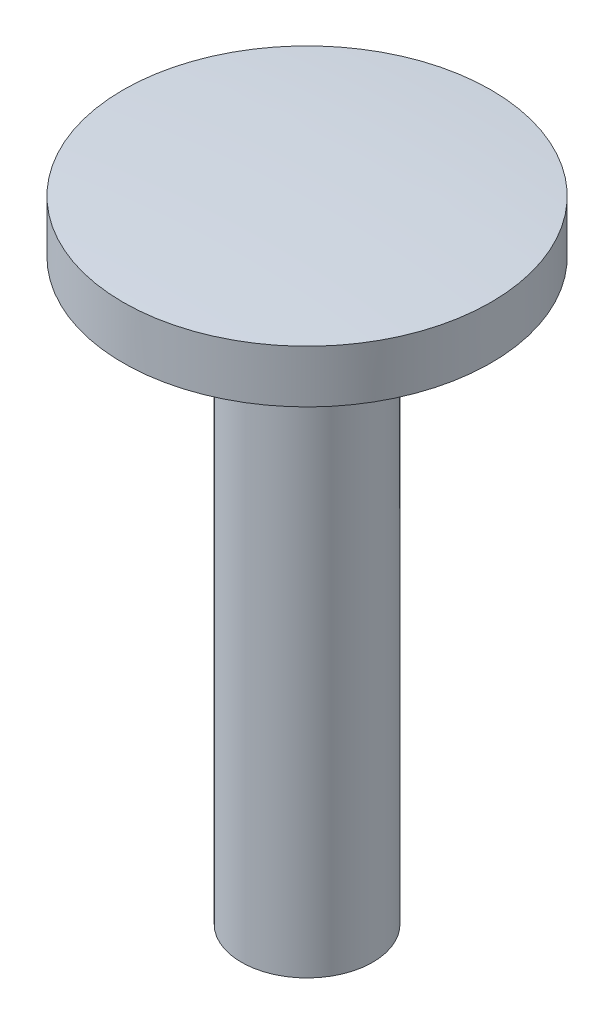
ISO-10303-21;
HEADER;
FILE_DESCRIPTION(('STEP AP214'),'2;1');
FILE_NAME('part.step','',(''),(''),'','','');
FILE_SCHEMA(('AUTOMOTIVE_DESIGN { 1 0 10303 214 1 1 1 1 }'));
ENDSEC;
DATA;
#1=APPLICATION_CONTEXT('core data for automotive mechanical design processes');
#2=APPLICATION_PROTOCOL_DEFINITION('international standard','automotive_design',2000,#1);
#3=PRODUCT_CONTEXT('',#1,'mechanical');
#4=PRODUCT('Part','Part','',(#3));
#5=PRODUCT_RELATED_PRODUCT_CATEGORY('part','',(#4));
#6=PRODUCT_DEFINITION_FORMATION('','',#4);
#7=PRODUCT_DEFINITION_CONTEXT('part definition',#1,'design');
#8=PRODUCT_DEFINITION('design','',#6,#7);
#9=PRODUCT_DEFINITION_SHAPE('','',#8);
#10=(LENGTH_UNIT() NAMED_UNIT(*) SI_UNIT(.MILLI.,.METRE.));
#11=(NAMED_UNIT(*) PLANE_ANGLE_UNIT() SI_UNIT($,.RADIAN.));
#12=(NAMED_UNIT(*) SI_UNIT($,.STERADIAN.) SOLID_ANGLE_UNIT());
#13=UNCERTAINTY_MEASURE_WITH_UNIT(LENGTH_MEASURE(1.E-05),#10,'distance_accuracy_value','');
#14=(GEOMETRIC_REPRESENTATION_CONTEXT(3) GLOBAL_UNCERTAINTY_ASSIGNED_CONTEXT((#13)) GLOBAL_UNIT_ASSIGNED_CONTEXT((#10,
#11,#12)) REPRESENTATION_CONTEXT('',''));
#15=CARTESIAN_POINT('',(0.,0.,0.));
#16=DIRECTION('',(0.,0.,1.));
#17=DIRECTION('',(1.,0.,0.));
#18=AXIS2_PLACEMENT_3D('',#15,#16,#17);
#19=CARTESIAN_POINT('',(0.,-70.,0.));
#20=DIRECTION('',(0.,-1.,0.));
#21=DIRECTION('',(0.,0.,1.));
#22=AXIS2_PLACEMENT_3D('',#19,#20,#21);
#23=SPHERICAL_SURFACE('',#22,94.2602779541839);
#24=CARTESIAN_POINT('',(0.,24.,0.));
#25=DIRECTION('',(0.,-1.,0.));
#26=DIRECTION('',(0.,0.,-1.));
#27=AXIS2_PLACEMENT_3D('',#24,#25,#26);
#28=CIRCLE('',#27,7.);
#29=CARTESIAN_POINT('',(0.,24.,-7.));
#30=VERTEX_POINT('',#29);
#31=EDGE_CURVE('E10',#30,#30,#28,.T.);
#32=ORIENTED_EDGE('',*,*,#31,.F.);
#33=EDGE_LOOP('',(#32));
#34=FACE_BOUND('',#33,.T.);
#35=ADVANCED_FACE('F30',(#34),#23,.T.);
#36=CARTESIAN_POINT('',(0.,0.,0.));
#37=DIRECTION('',(0.,-1.,0.));
#38=DIRECTION('',(0.,0.,-1.));
#39=AXIS2_PLACEMENT_3D('',#36,#37,#38);
#40=CYLINDRICAL_SURFACE('',#39,7.);
#41=CARTESIAN_POINT('',(0.,22.,0.));
#42=DIRECTION('',(0.,-1.,0.));
#43=DIRECTION('',(0.,0.,-1.));
#44=AXIS2_PLACEMENT_3D('',#41,#42,#43);
#45=CIRCLE('',#44,7.);
#46=CARTESIAN_POINT('',(0.,22.,-7.));
#47=VERTEX_POINT('',#46);
#48=EDGE_CURVE('E36',#47,#47,#45,.T.);
#49=ORIENTED_EDGE('',*,*,#48,.F.);
#50=EDGE_LOOP('',(#49));
#51=FACE_BOUND('',#50,.T.);
#52=ORIENTED_EDGE('',*,*,#31,.T.);
#53=EDGE_LOOP('',(#52));
#54=FACE_BOUND('',#53,.T.);
#55=ADVANCED_FACE('F69',(#51,#54),#40,.T.);
#56=CARTESIAN_POINT('',(0.,22.,4.50000000000001));
#57=DIRECTION('',(0.,1.,0.));
#58=DIRECTION('',(0.,0.,1.));
#59=AXIS2_PLACEMENT_3D('',#56,#57,#58);
#60=PLANE('',#59);
#61=CARTESIAN_POINT('',(0.,22.,0.));
#62=DIRECTION('',(0.,-1.,0.));
#63=DIRECTION('',(0.,0.,-1.));
#64=AXIS2_PLACEMENT_3D('',#61,#62,#63);
#65=CIRCLE('',#64,4.50000000000001);
#66=CARTESIAN_POINT('',(0.,22.,-4.50000000000001));
#67=VERTEX_POINT('',#66);
#68=EDGE_CURVE('E40',#67,#67,#65,.T.);
#69=ORIENTED_EDGE('',*,*,#68,.F.);
#70=EDGE_LOOP('',(#69));
#71=FACE_BOUND('',#70,.T.);
#72=ORIENTED_EDGE('',*,*,#48,.T.);
#73=EDGE_LOOP('',(#72));
#74=FACE_BOUND('',#73,.T.);
#75=ADVANCED_FACE('F64',(#71,#74),#60,.F.);
#76=CARTESIAN_POINT('',(0.,20.,0.));
#77=DIRECTION('',(0.,-1.,0.));
#78=DIRECTION('',(0.,0.,-1.));
#79=AXIS2_PLACEMENT_3D('',#76,#77,#78);
#80=TOROIDAL_SURFACE('',#79,4.5,2.);
#81=CARTESIAN_POINT('',(0.,20.,0.));
#82=DIRECTION('',(0.,-1.,0.));
#83=DIRECTION('',(0.,0.,-1.));
#84=AXIS2_PLACEMENT_3D('',#81,#82,#83);
#85=CIRCLE('',#84,2.5);
#86=CARTESIAN_POINT('',(0.,20.,-2.5));
#87=VERTEX_POINT('',#86);
#88=EDGE_CURVE('E44',#87,#87,#85,.T.);
#89=ORIENTED_EDGE('',*,*,#88,.F.);
#90=EDGE_LOOP('',(#89));
#91=FACE_BOUND('',#90,.T.);
#92=ORIENTED_EDGE('',*,*,#68,.T.);
#93=EDGE_LOOP('',(#92));
#94=FACE_BOUND('',#93,.T.);
#95=ADVANCED_FACE('F58',(#91,#94),#80,.F.);
#96=CARTESIAN_POINT('',(0.,0.,0.));
#97=DIRECTION('',(0.,-1.,0.));
#98=DIRECTION('',(0.,0.,-1.));
#99=AXIS2_PLACEMENT_3D('',#96,#97,#98);
#100=CYLINDRICAL_SURFACE('',#99,2.5);
#101=CARTESIAN_POINT('',(0.,0.,0.));
#102=DIRECTION('',(0.,-1.,0.));
#103=DIRECTION('',(0.,0.,-1.));
#104=AXIS2_PLACEMENT_3D('',#101,#102,#103);
#105=CIRCLE('',#104,2.5);
#106=CARTESIAN_POINT('',(0.,0.,-2.5));
#107=VERTEX_POINT('',#106);
#108=EDGE_CURVE('E49',#107,#107,#105,.T.);
#109=ORIENTED_EDGE('',*,*,#108,.F.);
#110=EDGE_LOOP('',(#109));
#111=FACE_BOUND('',#110,.T.);
#112=ORIENTED_EDGE('',*,*,#88,.T.);
#113=EDGE_LOOP('',(#112));
#114=FACE_BOUND('',#113,.T.);
#115=ADVANCED_FACE('F55',(#111,#114),#100,.T.);
#116=CARTESIAN_POINT('',(0.,0.,0.));
#117=DIRECTION('',(0.,1.,0.));
#118=DIRECTION('',(0.,0.,1.));
#119=AXIS2_PLACEMENT_3D('',#116,#117,#118);
#120=PLANE('',#119);
#121=ORIENTED_EDGE('',*,*,#108,.T.);
#122=EDGE_LOOP('',(#121));
#123=FACE_BOUND('',#122,.T.);
#124=ADVANCED_FACE('F53',(#123),#120,.F.);
#125=CLOSED_SHELL('',(#35,#55,#75,#95,#115,#124));
#126=MANIFOLD_SOLID_BREP('B2',#125);
#127=ADVANCED_BREP_SHAPE_REPRESENTATION('',(#18,#126),#14);
#128=SHAPE_DEFINITION_REPRESENTATION(#9,#127);
ENDSEC;
END-ISO-10303-21;
